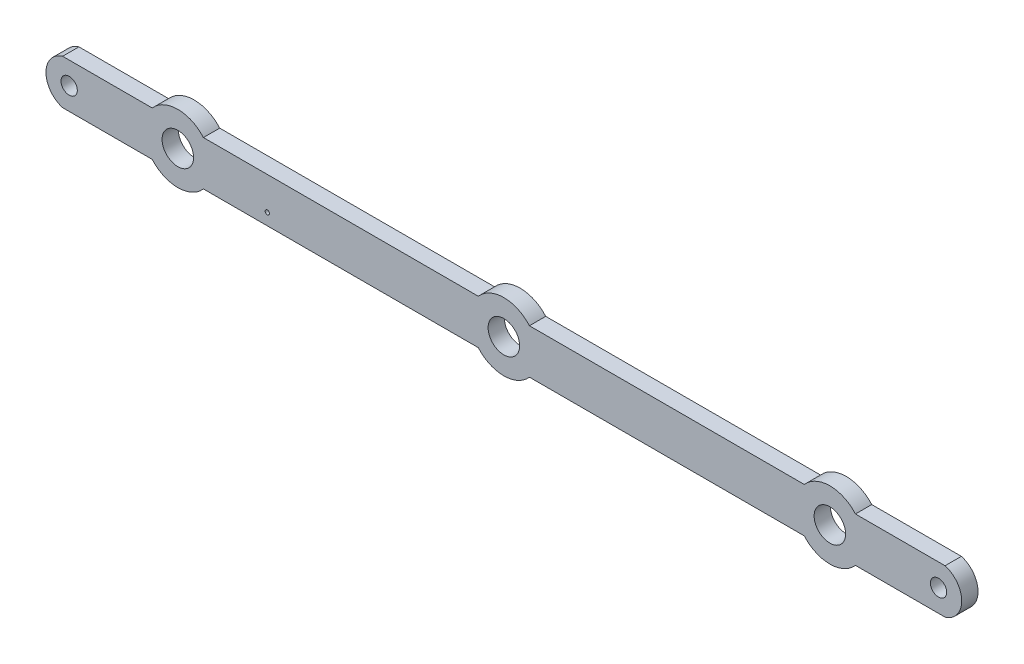
ISO-10303-21;
HEADER;
FILE_DESCRIPTION(('STEP AP214'),'2;1');
FILE_NAME('part.step','',(''),(''),'','','');
FILE_SCHEMA(('AUTOMOTIVE_DESIGN { 1 0 10303 214 1 1 1 1 }'));
ENDSEC;
DATA;
#1=APPLICATION_CONTEXT('core data for automotive mechanical design processes');
#2=APPLICATION_PROTOCOL_DEFINITION('international standard','automotive_design',2000,#1);
#3=PRODUCT_CONTEXT('',#1,'mechanical');
#4=PRODUCT('Part','Part','',(#3));
#5=PRODUCT_RELATED_PRODUCT_CATEGORY('part','',(#4));
#6=PRODUCT_DEFINITION_FORMATION('','',#4);
#7=PRODUCT_DEFINITION_CONTEXT('part definition',#1,'design');
#8=PRODUCT_DEFINITION('design','',#6,#7);
#9=PRODUCT_DEFINITION_SHAPE('','',#8);
#10=(LENGTH_UNIT() NAMED_UNIT(*) SI_UNIT(.MILLI.,.METRE.));
#11=(NAMED_UNIT(*) PLANE_ANGLE_UNIT() SI_UNIT($,.RADIAN.));
#12=(NAMED_UNIT(*) SI_UNIT($,.STERADIAN.) SOLID_ANGLE_UNIT());
#13=UNCERTAINTY_MEASURE_WITH_UNIT(LENGTH_MEASURE(1.E-05),#10,'distance_accuracy_value','');
#14=(GEOMETRIC_REPRESENTATION_CONTEXT(3) GLOBAL_UNCERTAINTY_ASSIGNED_CONTEXT((#13)) GLOBAL_UNIT_ASSIGNED_CONTEXT((#10,
#11,#12)) REPRESENTATION_CONTEXT('',''));
#15=CARTESIAN_POINT('',(0.,0.,0.));
#16=DIRECTION('',(0.,0.,1.));
#17=DIRECTION('',(1.,0.,0.));
#18=AXIS2_PLACEMENT_3D('',#15,#16,#17);
#19=CARTESIAN_POINT('',(-60.,0.,3.));
#20=DIRECTION('',(0.,0.,-1.));
#21=DIRECTION('',(-1.,0.,0.));
#22=AXIS2_PLACEMENT_3D('',#19,#20,#21);
#23=PLANE('',#22);
#24=CARTESIAN_POINT('',(-60.,0.,3.));
#25=DIRECTION('',(0.,0.,1.));
#26=DIRECTION('',(-1.,0.,0.));
#27=AXIS2_PLACEMENT_3D('',#24,#25,#26);
#28=CIRCLE('',#27,6.24);
#29=CARTESIAN_POINT('',(-55.2937429206202,4.09740702185994,3.));
#30=VERTEX_POINT('',#29);
#31=CARTESIAN_POINT('',(-64.7062570793798,4.09740702185994,3.));
#32=VERTEX_POINT('',#31);
#33=EDGE_CURVE('E217',#30,#32,#28,.T.);
#34=ORIENTED_EDGE('',*,*,#33,.T.);
#35=DIRECTION('',(-1.,0.,0.));
#36=VECTOR('',#35,1.);
#37=CARTESIAN_POINT('',(-81.2017302930412,4.09740702185994,3.));
#38=LINE('',#37,#36);
#39=CARTESIAN_POINT('',(-81.2017302930412,4.09740702185994,3.));
#40=VERTEX_POINT('',#39);
#41=EDGE_CURVE('E125',#32,#40,#38,.T.);
#42=ORIENTED_EDGE('',*,*,#41,.T.);
#43=CARTESIAN_POINT('',(-80.,0.,3.));
#44=DIRECTION('',(0.,0.,1.));
#45=DIRECTION('',(1.,0.,0.));
#46=AXIS2_PLACEMENT_3D('',#43,#44,#45);
#47=CIRCLE('',#46,4.27);
#48=CARTESIAN_POINT('',(-81.2017302930412,-4.09740702185994,3.));
#49=VERTEX_POINT('',#48);
#50=EDGE_CURVE('E256',#40,#49,#47,.T.);
#51=ORIENTED_EDGE('',*,*,#50,.T.);
#52=DIRECTION('',(1.,0.,0.));
#53=VECTOR('',#52,1.);
#54=CARTESIAN_POINT('',(-81.2017302930412,-4.09740702185994,3.));
#55=LINE('',#54,#53);
#56=CARTESIAN_POINT('',(-64.7062570793798,-4.09740702185994,3.));
#57=VERTEX_POINT('',#56);
#58=EDGE_CURVE('E275',#49,#57,#55,.T.);
#59=ORIENTED_EDGE('',*,*,#58,.T.);
#60=CARTESIAN_POINT('',(-60.,0.,3.));
#61=DIRECTION('',(0.,0.,1.));
#62=DIRECTION('',(1.,0.,0.));
#63=AXIS2_PLACEMENT_3D('',#60,#61,#62);
#64=CIRCLE('',#63,6.24);
#65=CARTESIAN_POINT('',(-55.2937429206202,-4.09740702185994,3.));
#66=VERTEX_POINT('',#65);
#67=EDGE_CURVE('E272',#57,#66,#64,.T.);
#68=ORIENTED_EDGE('',*,*,#67,.T.);
#69=DIRECTION('',(1.,0.,0.));
#70=VECTOR('',#69,1.);
#71=CARTESIAN_POINT('',(-55.2937429206202,-4.09740702185994,3.));
#72=LINE('',#71,#70);
#73=CARTESIAN_POINT('',(-4.70625707937984,-4.09740702185994,3.));
#74=VERTEX_POINT('',#73);
#75=EDGE_CURVE('E274',#66,#74,#72,.T.);
#76=ORIENTED_EDGE('',*,*,#75,.T.);
#77=CARTESIAN_POINT('',(0.,0.,3.));
#78=DIRECTION('',(0.,0.,1.));
#79=DIRECTION('',(1.,0.,0.));
#80=AXIS2_PLACEMENT_3D('',#77,#78,#79);
#81=CIRCLE('',#80,6.24);
#82=CARTESIAN_POINT('',(4.70625707937984,-4.09740702185994,3.));
#83=VERTEX_POINT('',#82);
#84=EDGE_CURVE('E277',#74,#83,#81,.T.);
#85=ORIENTED_EDGE('',*,*,#84,.T.);
#86=DIRECTION('',(1.,0.,0.));
#87=VECTOR('',#86,1.);
#88=CARTESIAN_POINT('',(4.70625707937984,-4.09740702185994,3.));
#89=LINE('',#88,#87);
#90=CARTESIAN_POINT('',(55.2937429206202,-4.09740702185994,3.));
#91=VERTEX_POINT('',#90);
#92=EDGE_CURVE('E283',#83,#91,#89,.T.);
#93=ORIENTED_EDGE('',*,*,#92,.T.);
#94=CARTESIAN_POINT('',(60.,0.,3.));
#95=DIRECTION('',(0.,0.,1.));
#96=DIRECTION('',(1.,0.,0.));
#97=AXIS2_PLACEMENT_3D('',#94,#95,#96);
#98=CIRCLE('',#97,6.24);
#99=CARTESIAN_POINT('',(64.7062570793798,-4.09740702185994,3.));
#100=VERTEX_POINT('',#99);
#101=EDGE_CURVE('E285',#91,#100,#98,.T.);
#102=ORIENTED_EDGE('',*,*,#101,.T.);
#103=DIRECTION('',(1.,0.,0.));
#104=VECTOR('',#103,1.);
#105=CARTESIAN_POINT('',(64.7062570793798,-4.09740702185994,3.));
#106=LINE('',#105,#104);
#107=CARTESIAN_POINT('',(81.2017302930412,-4.09740702185994,3.));
#108=VERTEX_POINT('',#107);
#109=EDGE_CURVE('E287',#100,#108,#106,.T.);
#110=ORIENTED_EDGE('',*,*,#109,.T.);
#111=CARTESIAN_POINT('',(80.,0.,3.));
#112=DIRECTION('',(0.,0.,1.));
#113=DIRECTION('',(-1.,0.,0.));
#114=AXIS2_PLACEMENT_3D('',#111,#112,#113);
#115=CIRCLE('',#114,4.27);
#116=CARTESIAN_POINT('',(81.2017302930412,4.09740702185994,3.));
#117=VERTEX_POINT('',#116);
#118=EDGE_CURVE('E289',#108,#117,#115,.T.);
#119=ORIENTED_EDGE('',*,*,#118,.T.);
#120=DIRECTION('',(-1.,0.,0.));
#121=VECTOR('',#120,1.);
#122=CARTESIAN_POINT('',(64.7062570793798,4.09740702185994,3.));
#123=LINE('',#122,#121);
#124=CARTESIAN_POINT('',(64.7062570793798,4.09740702185994,3.));
#125=VERTEX_POINT('',#124);
#126=EDGE_CURVE('E291',#117,#125,#123,.T.);
#127=ORIENTED_EDGE('',*,*,#126,.T.);
#128=CARTESIAN_POINT('',(60.,0.,3.));
#129=DIRECTION('',(0.,0.,1.));
#130=DIRECTION('',(1.,0.,0.));
#131=AXIS2_PLACEMENT_3D('',#128,#129,#130);
#132=CIRCLE('',#131,6.24);
#133=CARTESIAN_POINT('',(55.2937429206202,4.09740702185994,3.));
#134=VERTEX_POINT('',#133);
#135=EDGE_CURVE('E168',#125,#134,#132,.T.);
#136=ORIENTED_EDGE('',*,*,#135,.T.);
#137=DIRECTION('',(-1.,0.,0.));
#138=VECTOR('',#137,1.);
#139=CARTESIAN_POINT('',(4.70625707937984,4.09740702185994,3.));
#140=LINE('',#139,#138);
#141=CARTESIAN_POINT('',(4.70625707937984,4.09740702185994,3.));
#142=VERTEX_POINT('',#141);
#143=EDGE_CURVE('E162',#134,#142,#140,.T.);
#144=ORIENTED_EDGE('',*,*,#143,.T.);
#145=CARTESIAN_POINT('',(0.,0.,3.));
#146=DIRECTION('',(0.,0.,1.));
#147=DIRECTION('',(1.,0.,0.));
#148=AXIS2_PLACEMENT_3D('',#145,#146,#147);
#149=CIRCLE('',#148,6.24);
#150=CARTESIAN_POINT('',(-4.70625707937984,4.09740702185994,3.));
#151=VERTEX_POINT('',#150);
#152=EDGE_CURVE('E166',#142,#151,#149,.T.);
#153=ORIENTED_EDGE('',*,*,#152,.T.);
#154=DIRECTION('',(-1.,0.,0.));
#155=VECTOR('',#154,1.);
#156=CARTESIAN_POINT('',(-55.2937429206202,4.09740702185994,3.));
#157=LINE('',#156,#155);
#158=EDGE_CURVE('E58',#151,#30,#157,.T.);
#159=ORIENTED_EDGE('',*,*,#158,.T.);
#160=EDGE_LOOP('',(#34,#42,#51,#59,#68,#76,#85,#93,#102,#110,#119,#127,#136,#144,#153,#159));
#161=FACE_BOUND('',#160,.T.);
#162=CARTESIAN_POINT('',(-60.,0.,3.));
#163=DIRECTION('',(0.,0.,1.));
#164=DIRECTION('',(1.,0.,0.));
#165=AXIS2_PLACEMENT_3D('',#162,#163,#164);
#166=CIRCLE('',#165,2.9);
#167=CARTESIAN_POINT('',(-57.1,0.,3.));
#168=VERTEX_POINT('',#167);
#169=EDGE_CURVE('E190',#168,#168,#166,.T.);
#170=ORIENTED_EDGE('',*,*,#169,.F.);
#171=EDGE_LOOP('',(#170));
#172=FACE_BOUND('',#171,.T.);
#173=CARTESIAN_POINT('',(0.,0.,3.));
#174=DIRECTION('',(0.,0.,1.));
#175=DIRECTION('',(1.,0.,0.));
#176=AXIS2_PLACEMENT_3D('',#173,#174,#175);
#177=CIRCLE('',#176,2.9);
#178=CARTESIAN_POINT('',(2.9,0.,3.));
#179=VERTEX_POINT('',#178);
#180=EDGE_CURVE('E375',#179,#179,#177,.T.);
#181=ORIENTED_EDGE('',*,*,#180,.F.);
#182=EDGE_LOOP('',(#181));
#183=FACE_BOUND('',#182,.T.);
#184=CARTESIAN_POINT('',(60.,0.,3.));
#185=DIRECTION('',(0.,0.,1.));
#186=DIRECTION('',(1.,0.,0.));
#187=AXIS2_PLACEMENT_3D('',#184,#185,#186);
#188=CIRCLE('',#187,2.90000000000003);
#189=CARTESIAN_POINT('',(62.9,0.,3.));
#190=VERTEX_POINT('',#189);
#191=EDGE_CURVE('E369',#190,#190,#188,.T.);
#192=ORIENTED_EDGE('',*,*,#191,.F.);
#193=EDGE_LOOP('',(#192));
#194=FACE_BOUND('',#193,.T.);
#195=CARTESIAN_POINT('',(80.,0.,3.));
#196=DIRECTION('',(0.,0.,1.));
#197=DIRECTION('',(1.,0.,0.));
#198=AXIS2_PLACEMENT_3D('',#195,#196,#197);
#199=CIRCLE('',#198,1.5);
#200=CARTESIAN_POINT('',(81.5,0.,3.));
#201=VERTEX_POINT('',#200);
#202=EDGE_CURVE('E363',#201,#201,#199,.T.);
#203=ORIENTED_EDGE('',*,*,#202,.F.);
#204=EDGE_LOOP('',(#203));
#205=FACE_BOUND('',#204,.T.);
#206=CARTESIAN_POINT('',(-80.,0.,3.));
#207=DIRECTION('',(0.,0.,1.));
#208=DIRECTION('',(1.,0.,0.));
#209=AXIS2_PLACEMENT_3D('',#206,#207,#208);
#210=CIRCLE('',#209,1.5);
#211=CARTESIAN_POINT('',(-78.5,0.,3.));
#212=VERTEX_POINT('',#211);
#213=EDGE_CURVE('E357',#212,#212,#210,.T.);
#214=ORIENTED_EDGE('',*,*,#213,.F.);
#215=EDGE_LOOP('',(#214));
#216=FACE_BOUND('',#215,.T.);
#217=CARTESIAN_POINT('',(-43.533553557527,-1.94889321049629,3.));
#218=DIRECTION('',(0.,0.,1.));
#219=DIRECTION('',(1.,0.,0.));
#220=AXIS2_PLACEMENT_3D('',#217,#218,#219);
#221=CIRCLE('',#220,0.390297289311418);
#222=CARTESIAN_POINT('',(-43.1432562682156,-1.94889321049629,3.));
#223=VERTEX_POINT('',#222);
#224=EDGE_CURVE('E348',#223,#223,#221,.T.);
#225=ORIENTED_EDGE('',*,*,#224,.F.);
#226=EDGE_LOOP('',(#225));
#227=FACE_BOUND('',#226,.T.);
#228=ADVANCED_FACE('F41',(#161,#172,#183,#194,#205,#216,#227),#23,.F.);
#229=CARTESIAN_POINT('',(-60.,0.,0.));
#230=DIRECTION('',(0.,0.,-1.));
#231=DIRECTION('',(-1.,0.,0.));
#232=AXIS2_PLACEMENT_3D('',#229,#230,#231);
#233=PLANE('',#232);
#234=CARTESIAN_POINT('',(-80.,0.,0.));
#235=DIRECTION('',(0.,0.,1.));
#236=DIRECTION('',(1.,0.,0.));
#237=AXIS2_PLACEMENT_3D('',#234,#235,#236);
#238=CIRCLE('',#237,1.5);
#239=CARTESIAN_POINT('',(-78.5,0.,0.));
#240=VERTEX_POINT('',#239);
#241=EDGE_CURVE('E354',#240,#240,#238,.T.);
#242=ORIENTED_EDGE('',*,*,#241,.T.);
#243=EDGE_LOOP('',(#242));
#244=FACE_BOUND('',#243,.T.);
#245=CARTESIAN_POINT('',(60.,0.,0.));
#246=DIRECTION('',(0.,0.,1.));
#247=DIRECTION('',(1.,0.,0.));
#248=AXIS2_PLACEMENT_3D('',#245,#246,#247);
#249=CIRCLE('',#248,2.90000000000003);
#250=CARTESIAN_POINT('',(62.9,0.,0.));
#251=VERTEX_POINT('',#250);
#252=EDGE_CURVE('E366',#251,#251,#249,.T.);
#253=ORIENTED_EDGE('',*,*,#252,.T.);
#254=EDGE_LOOP('',(#253));
#255=FACE_BOUND('',#254,.T.);
#256=CARTESIAN_POINT('',(-60.,0.,0.));
#257=DIRECTION('',(0.,0.,1.));
#258=DIRECTION('',(1.,0.,0.));
#259=AXIS2_PLACEMENT_3D('',#256,#257,#258);
#260=CIRCLE('',#259,2.9);
#261=CARTESIAN_POINT('',(-57.1,0.,0.));
#262=VERTEX_POINT('',#261);
#263=EDGE_CURVE('E378',#262,#262,#260,.T.);
#264=ORIENTED_EDGE('',*,*,#263,.T.);
#265=EDGE_LOOP('',(#264));
#266=FACE_BOUND('',#265,.T.);
#267=CARTESIAN_POINT('',(-60.,0.,0.));
#268=DIRECTION('',(0.,0.,1.));
#269=DIRECTION('',(-1.,0.,0.));
#270=AXIS2_PLACEMENT_3D('',#267,#268,#269);
#271=CIRCLE('',#270,6.24);
#272=CARTESIAN_POINT('',(-55.2937429206202,4.09740702185994,0.));
#273=VERTEX_POINT('',#272);
#274=CARTESIAN_POINT('',(-64.7062570793798,4.09740702185994,0.));
#275=VERTEX_POINT('',#274);
#276=EDGE_CURVE('E186',#273,#275,#271,.T.);
#277=ORIENTED_EDGE('',*,*,#276,.F.);
#278=DIRECTION('',(-1.,0.,0.));
#279=VECTOR('',#278,1.);
#280=CARTESIAN_POINT('',(-55.2937429206202,4.09740702185994,0.));
#281=LINE('',#280,#279);
#282=CARTESIAN_POINT('',(-4.70625707937984,4.09740702185994,0.));
#283=VERTEX_POINT('',#282);
#284=EDGE_CURVE('E117',#283,#273,#281,.T.);
#285=ORIENTED_EDGE('',*,*,#284,.F.);
#286=CARTESIAN_POINT('',(0.,0.,0.));
#287=DIRECTION('',(0.,0.,1.));
#288=DIRECTION('',(1.,0.,0.));
#289=AXIS2_PLACEMENT_3D('',#286,#287,#288);
#290=CIRCLE('',#289,6.24);
#291=CARTESIAN_POINT('',(4.70625707937984,4.09740702185994,0.));
#292=VERTEX_POINT('',#291);
#293=EDGE_CURVE('E111',#292,#283,#290,.T.);
#294=ORIENTED_EDGE('',*,*,#293,.F.);
#295=DIRECTION('',(-1.,0.,0.));
#296=VECTOR('',#295,1.);
#297=CARTESIAN_POINT('',(4.70625707937984,4.09740702185994,0.));
#298=LINE('',#297,#296);
#299=CARTESIAN_POINT('',(55.2937429206202,4.09740702185994,0.));
#300=VERTEX_POINT('',#299);
#301=EDGE_CURVE('E176',#300,#292,#298,.T.);
#302=ORIENTED_EDGE('',*,*,#301,.F.);
#303=CARTESIAN_POINT('',(60.,0.,0.));
#304=DIRECTION('',(0.,0.,1.));
#305=DIRECTION('',(1.,0.,0.));
#306=AXIS2_PLACEMENT_3D('',#303,#304,#305);
#307=CIRCLE('',#306,6.24);
#308=CARTESIAN_POINT('',(64.7062570793798,4.09740702185994,0.));
#309=VERTEX_POINT('',#308);
#310=EDGE_CURVE('E212',#309,#300,#307,.T.);
#311=ORIENTED_EDGE('',*,*,#310,.F.);
#312=DIRECTION('',(-1.,0.,0.));
#313=VECTOR('',#312,1.);
#314=CARTESIAN_POINT('',(64.7062570793798,4.09740702185994,0.));
#315=LINE('',#314,#313);
#316=CARTESIAN_POINT('',(81.2017302930412,4.09740702185994,0.));
#317=VERTEX_POINT('',#316);
#318=EDGE_CURVE('E210',#317,#309,#315,.T.);
#319=ORIENTED_EDGE('',*,*,#318,.F.);
#320=CARTESIAN_POINT('',(80.,0.,0.));
#321=DIRECTION('',(0.,0.,1.));
#322=DIRECTION('',(-1.,0.,0.));
#323=AXIS2_PLACEMENT_3D('',#320,#321,#322);
#324=CIRCLE('',#323,4.27);
#325=CARTESIAN_POINT('',(81.2017302930412,-4.09740702185994,0.));
#326=VERTEX_POINT('',#325);
#327=EDGE_CURVE('E208',#326,#317,#324,.T.);
#328=ORIENTED_EDGE('',*,*,#327,.F.);
#329=DIRECTION('',(1.,0.,0.));
#330=VECTOR('',#329,1.);
#331=CARTESIAN_POINT('',(64.7062570793798,-4.09740702185994,0.));
#332=LINE('',#331,#330);
#333=CARTESIAN_POINT('',(64.7062570793798,-4.09740702185994,0.));
#334=VERTEX_POINT('',#333);
#335=EDGE_CURVE('E206',#334,#326,#332,.T.);
#336=ORIENTED_EDGE('',*,*,#335,.F.);
#337=CARTESIAN_POINT('',(60.,0.,0.));
#338=DIRECTION('',(0.,0.,1.));
#339=DIRECTION('',(1.,0.,0.));
#340=AXIS2_PLACEMENT_3D('',#337,#338,#339);
#341=CIRCLE('',#340,6.24);
#342=CARTESIAN_POINT('',(55.2937429206202,-4.09740702185994,0.));
#343=VERTEX_POINT('',#342);
#344=EDGE_CURVE('E204',#343,#334,#341,.T.);
#345=ORIENTED_EDGE('',*,*,#344,.F.);
#346=DIRECTION('',(1.,0.,0.));
#347=VECTOR('',#346,1.);
#348=CARTESIAN_POINT('',(4.70625707937984,-4.09740702185994,0.));
#349=LINE('',#348,#347);
#350=CARTESIAN_POINT('',(4.70625707937984,-4.09740702185994,0.));
#351=VERTEX_POINT('',#350);
#352=EDGE_CURVE('E202',#351,#343,#349,.T.);
#353=ORIENTED_EDGE('',*,*,#352,.F.);
#354=CARTESIAN_POINT('',(0.,0.,0.));
#355=DIRECTION('',(0.,0.,1.));
#356=DIRECTION('',(1.,0.,0.));
#357=AXIS2_PLACEMENT_3D('',#354,#355,#356);
#358=CIRCLE('',#357,6.24);
#359=CARTESIAN_POINT('',(-4.70625707937984,-4.09740702185994,0.));
#360=VERTEX_POINT('',#359);
#361=EDGE_CURVE('E200',#360,#351,#358,.T.);
#362=ORIENTED_EDGE('',*,*,#361,.F.);
#363=DIRECTION('',(1.,0.,0.));
#364=VECTOR('',#363,1.);
#365=CARTESIAN_POINT('',(-55.2937429206202,-4.09740702185994,0.));
#366=LINE('',#365,#364);
#367=CARTESIAN_POINT('',(-55.2937429206202,-4.09740702185994,0.));
#368=VERTEX_POINT('',#367);
#369=EDGE_CURVE('E198',#368,#360,#366,.T.);
#370=ORIENTED_EDGE('',*,*,#369,.F.);
#371=CARTESIAN_POINT('',(-60.,0.,0.));
#372=DIRECTION('',(0.,0.,1.));
#373=DIRECTION('',(1.,0.,0.));
#374=AXIS2_PLACEMENT_3D('',#371,#372,#373);
#375=CIRCLE('',#374,6.24);
#376=CARTESIAN_POINT('',(-64.7062570793798,-4.09740702185994,0.));
#377=VERTEX_POINT('',#376);
#378=EDGE_CURVE('E196',#377,#368,#375,.T.);
#379=ORIENTED_EDGE('',*,*,#378,.F.);
#380=DIRECTION('',(1.,0.,0.));
#381=VECTOR('',#380,1.);
#382=CARTESIAN_POINT('',(-81.2017302930412,-4.09740702185994,0.));
#383=LINE('',#382,#381);
#384=CARTESIAN_POINT('',(-81.2017302930412,-4.09740702185994,0.));
#385=VERTEX_POINT('',#384);
#386=EDGE_CURVE('E194',#385,#377,#383,.T.);
#387=ORIENTED_EDGE('',*,*,#386,.F.);
#388=CARTESIAN_POINT('',(-80.,0.,0.));
#389=DIRECTION('',(0.,0.,1.));
#390=DIRECTION('',(1.,0.,0.));
#391=AXIS2_PLACEMENT_3D('',#388,#389,#390);
#392=CIRCLE('',#391,4.27);
#393=CARTESIAN_POINT('',(-81.2017302930412,4.09740702185994,0.));
#394=VERTEX_POINT('',#393);
#395=EDGE_CURVE('E192',#394,#385,#392,.T.);
#396=ORIENTED_EDGE('',*,*,#395,.F.);
#397=DIRECTION('',(-1.,0.,0.));
#398=VECTOR('',#397,1.);
#399=CARTESIAN_POINT('',(-81.2017302930412,4.09740702185994,0.));
#400=LINE('',#399,#398);
#401=EDGE_CURVE('E189',#275,#394,#400,.T.);
#402=ORIENTED_EDGE('',*,*,#401,.F.);
#403=EDGE_LOOP('',(#277,#285,#294,#302,#311,#319,#328,#336,#345,#353,#362,#370,#379,#387,#396,#402));
#404=FACE_BOUND('',#403,.T.);
#405=CARTESIAN_POINT('',(0.,0.,0.));
#406=DIRECTION('',(0.,0.,1.));
#407=DIRECTION('',(1.,0.,0.));
#408=AXIS2_PLACEMENT_3D('',#405,#406,#407);
#409=CIRCLE('',#408,2.9);
#410=CARTESIAN_POINT('',(2.9,0.,0.));
#411=VERTEX_POINT('',#410);
#412=EDGE_CURVE('E372',#411,#411,#409,.T.);
#413=ORIENTED_EDGE('',*,*,#412,.T.);
#414=EDGE_LOOP('',(#413));
#415=FACE_BOUND('',#414,.T.);
#416=CARTESIAN_POINT('',(80.,0.,0.));
#417=DIRECTION('',(0.,0.,1.));
#418=DIRECTION('',(1.,0.,0.));
#419=AXIS2_PLACEMENT_3D('',#416,#417,#418);
#420=CIRCLE('',#419,1.5);
#421=CARTESIAN_POINT('',(81.5,0.,0.));
#422=VERTEX_POINT('',#421);
#423=EDGE_CURVE('E360',#422,#422,#420,.T.);
#424=ORIENTED_EDGE('',*,*,#423,.T.);
#425=EDGE_LOOP('',(#424));
#426=FACE_BOUND('',#425,.T.);
#427=CARTESIAN_POINT('',(-43.533553557527,-1.94889321049629,0.));
#428=DIRECTION('',(0.,0.,1.));
#429=DIRECTION('',(1.,0.,0.));
#430=AXIS2_PLACEMENT_3D('',#427,#428,#429);
#431=CIRCLE('',#430,0.390297289311418);
#432=CARTESIAN_POINT('',(-43.1432562682156,-1.94889321049629,0.));
#433=VERTEX_POINT('',#432);
#434=EDGE_CURVE('E351',#433,#433,#431,.T.);
#435=ORIENTED_EDGE('',*,*,#434,.T.);
#436=EDGE_LOOP('',(#435));
#437=FACE_BOUND('',#436,.T.);
#438=ADVANCED_FACE('F260',(#244,#255,#266,#404,#415,#426,#437),#233,.T.);
#439=CARTESIAN_POINT('',(-60.,0.,3.));
#440=DIRECTION('',(0.,0.,-1.));
#441=DIRECTION('',(-1.,0.,0.));
#442=AXIS2_PLACEMENT_3D('',#439,#440,#441);
#443=CYLINDRICAL_SURFACE('',#442,6.24);
#444=ORIENTED_EDGE('',*,*,#276,.T.);
#445=DIRECTION('',(0.,0.,-1.));
#446=VECTOR('',#445,1.);
#447=CARTESIAN_POINT('',(-64.7062570793798,4.09740702185994,3.));
#448=LINE('',#447,#446);
#449=EDGE_CURVE('E11',#32,#275,#448,.T.);
#450=ORIENTED_EDGE('',*,*,#449,.F.);
#451=ORIENTED_EDGE('',*,*,#33,.F.);
#452=DIRECTION('',(0.,0.,-1.));
#453=VECTOR('',#452,1.);
#454=CARTESIAN_POINT('',(-55.2937429206202,4.09740702185994,3.));
#455=LINE('',#454,#453);
#456=EDGE_CURVE('E182',#30,#273,#455,.T.);
#457=ORIENTED_EDGE('',*,*,#456,.T.);
#458=EDGE_LOOP('',(#444,#450,#451,#457));
#459=FACE_BOUND('',#458,.T.);
#460=ADVANCED_FACE('F43',(#459),#443,.T.);
#461=CARTESIAN_POINT('',(-81.2017302930412,4.09740702185994,3.));
#462=DIRECTION('',(0.,-1.,0.));
#463=DIRECTION('',(0.,0.,-1.));
#464=AXIS2_PLACEMENT_3D('',#461,#462,#463);
#465=PLANE('',#464);
#466=ORIENTED_EDGE('',*,*,#401,.T.);
#467=DIRECTION('',(0.,0.,-1.));
#468=VECTOR('',#467,1.);
#469=CARTESIAN_POINT('',(-81.2017302930412,4.09740702185994,3.));
#470=LINE('',#469,#468);
#471=EDGE_CURVE('E50',#40,#394,#470,.T.);
#472=ORIENTED_EDGE('',*,*,#471,.F.);
#473=ORIENTED_EDGE('',*,*,#41,.F.);
#474=ORIENTED_EDGE('',*,*,#449,.T.);
#475=EDGE_LOOP('',(#466,#472,#473,#474));
#476=FACE_BOUND('',#475,.T.);
#477=ADVANCED_FACE('F562',(#476),#465,.F.);
#478=CARTESIAN_POINT('',(-80.,0.,3.));
#479=DIRECTION('',(0.,0.,-1.));
#480=DIRECTION('',(-1.,0.,0.));
#481=AXIS2_PLACEMENT_3D('',#478,#479,#480);
#482=CYLINDRICAL_SURFACE('',#481,4.27);
#483=ORIENTED_EDGE('',*,*,#395,.T.);
#484=DIRECTION('',(0.,0.,-1.));
#485=VECTOR('',#484,1.);
#486=CARTESIAN_POINT('',(-81.2017302930412,-4.09740702185994,3.));
#487=LINE('',#486,#485);
#488=EDGE_CURVE('E248',#49,#385,#487,.T.);
#489=ORIENTED_EDGE('',*,*,#488,.F.);
#490=ORIENTED_EDGE('',*,*,#50,.F.);
#491=ORIENTED_EDGE('',*,*,#471,.T.);
#492=EDGE_LOOP('',(#483,#489,#490,#491));
#493=FACE_BOUND('',#492,.T.);
#494=ADVANCED_FACE('F254',(#493),#482,.T.);
#495=CARTESIAN_POINT('',(-81.2017302930412,-4.09740702185994,3.));
#496=DIRECTION('',(0.,1.,0.));
#497=DIRECTION('',(0.,0.,1.));
#498=AXIS2_PLACEMENT_3D('',#495,#496,#497);
#499=PLANE('',#498);
#500=ORIENTED_EDGE('',*,*,#386,.T.);
#501=DIRECTION('',(0.,0.,-1.));
#502=VECTOR('',#501,1.);
#503=CARTESIAN_POINT('',(-64.7062570793798,-4.09740702185994,3.));
#504=LINE('',#503,#502);
#505=EDGE_CURVE('E245',#57,#377,#504,.T.);
#506=ORIENTED_EDGE('',*,*,#505,.F.);
#507=ORIENTED_EDGE('',*,*,#58,.F.);
#508=ORIENTED_EDGE('',*,*,#488,.T.);
#509=EDGE_LOOP('',(#500,#506,#507,#508));
#510=FACE_BOUND('',#509,.T.);
#511=ADVANCED_FACE('F266',(#510),#499,.F.);
#512=CARTESIAN_POINT('',(-60.,0.,3.));
#513=DIRECTION('',(0.,0.,-1.));
#514=DIRECTION('',(-1.,0.,0.));
#515=AXIS2_PLACEMENT_3D('',#512,#513,#514);
#516=CYLINDRICAL_SURFACE('',#515,6.24);
#517=ORIENTED_EDGE('',*,*,#378,.T.);
#518=DIRECTION('',(0.,0.,-1.));
#519=VECTOR('',#518,1.);
#520=CARTESIAN_POINT('',(-55.2937429206202,-4.09740702185994,3.));
#521=LINE('',#520,#519);
#522=EDGE_CURVE('E242',#66,#368,#521,.T.);
#523=ORIENTED_EDGE('',*,*,#522,.F.);
#524=ORIENTED_EDGE('',*,*,#67,.F.);
#525=ORIENTED_EDGE('',*,*,#505,.T.);
#526=EDGE_LOOP('',(#517,#523,#524,#525));
#527=FACE_BOUND('',#526,.T.);
#528=ADVANCED_FACE('F270',(#527),#516,.T.);
#529=CARTESIAN_POINT('',(-55.2937429206202,-4.09740702185994,3.));
#530=DIRECTION('',(0.,1.,0.));
#531=DIRECTION('',(-1.,0.,0.));
#532=AXIS2_PLACEMENT_3D('',#529,#530,#531);
#533=PLANE('',#532);
#534=ORIENTED_EDGE('',*,*,#369,.T.);
#535=DIRECTION('',(0.,0.,-1.));
#536=VECTOR('',#535,1.);
#537=CARTESIAN_POINT('',(-4.70625707937984,-4.09740702185994,3.));
#538=LINE('',#537,#536);
#539=EDGE_CURVE('E239',#74,#360,#538,.T.);
#540=ORIENTED_EDGE('',*,*,#539,.F.);
#541=ORIENTED_EDGE('',*,*,#75,.F.);
#542=ORIENTED_EDGE('',*,*,#522,.T.);
#543=EDGE_LOOP('',(#534,#540,#541,#542));
#544=FACE_BOUND('',#543,.T.);
#545=ADVANCED_FACE('F523',(#544),#533,.F.);
#546=CARTESIAN_POINT('',(0.,0.,3.));
#547=DIRECTION('',(0.,0.,-1.));
#548=DIRECTION('',(-1.,0.,0.));
#549=AXIS2_PLACEMENT_3D('',#546,#547,#548);
#550=CYLINDRICAL_SURFACE('',#549,6.24);
#551=ORIENTED_EDGE('',*,*,#361,.T.);
#552=DIRECTION('',(0.,0.,-1.));
#553=VECTOR('',#552,1.);
#554=CARTESIAN_POINT('',(4.70625707937984,-4.09740702185994,3.));
#555=LINE('',#554,#553);
#556=EDGE_CURVE('E236',#83,#351,#555,.T.);
#557=ORIENTED_EDGE('',*,*,#556,.F.);
#558=ORIENTED_EDGE('',*,*,#84,.F.);
#559=ORIENTED_EDGE('',*,*,#539,.T.);
#560=EDGE_LOOP('',(#551,#557,#558,#559));
#561=FACE_BOUND('',#560,.T.);
#562=ADVANCED_FACE('F512',(#561),#550,.T.);
#563=CARTESIAN_POINT('',(4.70625707937984,-4.09740702185994,3.));
#564=DIRECTION('',(0.,1.,0.));
#565=DIRECTION('',(-1.,0.,0.));
#566=AXIS2_PLACEMENT_3D('',#563,#564,#565);
#567=PLANE('',#566);
#568=ORIENTED_EDGE('',*,*,#352,.T.);
#569=DIRECTION('',(0.,0.,-1.));
#570=VECTOR('',#569,1.);
#571=CARTESIAN_POINT('',(55.2937429206202,-4.09740702185994,3.));
#572=LINE('',#571,#570);
#573=EDGE_CURVE('E233',#91,#343,#572,.T.);
#574=ORIENTED_EDGE('',*,*,#573,.F.);
#575=ORIENTED_EDGE('',*,*,#92,.F.);
#576=ORIENTED_EDGE('',*,*,#556,.T.);
#577=EDGE_LOOP('',(#568,#574,#575,#576));
#578=FACE_BOUND('',#577,.T.);
#579=ADVANCED_FACE('F501',(#578),#567,.F.);
#580=CARTESIAN_POINT('',(60.,0.,3.));
#581=DIRECTION('',(0.,0.,-1.));
#582=DIRECTION('',(-1.,0.,0.));
#583=AXIS2_PLACEMENT_3D('',#580,#581,#582);
#584=CYLINDRICAL_SURFACE('',#583,6.24);
#585=ORIENTED_EDGE('',*,*,#344,.T.);
#586=DIRECTION('',(0.,0.,-1.));
#587=VECTOR('',#586,1.);
#588=CARTESIAN_POINT('',(64.7062570793798,-4.09740702185994,3.));
#589=LINE('',#588,#587);
#590=EDGE_CURVE('E230',#100,#334,#589,.T.);
#591=ORIENTED_EDGE('',*,*,#590,.F.);
#592=ORIENTED_EDGE('',*,*,#101,.F.);
#593=ORIENTED_EDGE('',*,*,#573,.T.);
#594=EDGE_LOOP('',(#585,#591,#592,#593));
#595=FACE_BOUND('',#594,.T.);
#596=ADVANCED_FACE('F490',(#595),#584,.T.);
#597=CARTESIAN_POINT('',(64.7062570793798,-4.09740702185994,3.));
#598=DIRECTION('',(0.,1.,0.));
#599=DIRECTION('',(-1.,0.,0.));
#600=AXIS2_PLACEMENT_3D('',#597,#598,#599);
#601=PLANE('',#600);
#602=ORIENTED_EDGE('',*,*,#335,.T.);
#603=DIRECTION('',(0.,0.,-1.));
#604=VECTOR('',#603,1.);
#605=CARTESIAN_POINT('',(81.2017302930412,-4.09740702185994,3.));
#606=LINE('',#605,#604);
#607=EDGE_CURVE('E227',#108,#326,#606,.T.);
#608=ORIENTED_EDGE('',*,*,#607,.F.);
#609=ORIENTED_EDGE('',*,*,#109,.F.);
#610=ORIENTED_EDGE('',*,*,#590,.T.);
#611=EDGE_LOOP('',(#602,#608,#609,#610));
#612=FACE_BOUND('',#611,.T.);
#613=ADVANCED_FACE('F479',(#612),#601,.F.);
#614=CARTESIAN_POINT('',(80.,0.,3.));
#615=DIRECTION('',(0.,0.,-1.));
#616=DIRECTION('',(-1.,0.,0.));
#617=AXIS2_PLACEMENT_3D('',#614,#615,#616);
#618=CYLINDRICAL_SURFACE('',#617,4.27);
#619=ORIENTED_EDGE('',*,*,#327,.T.);
#620=DIRECTION('',(0.,0.,-1.));
#621=VECTOR('',#620,1.);
#622=CARTESIAN_POINT('',(81.2017302930412,4.09740702185994,3.));
#623=LINE('',#622,#621);
#624=EDGE_CURVE('E224',#117,#317,#623,.T.);
#625=ORIENTED_EDGE('',*,*,#624,.F.);
#626=ORIENTED_EDGE('',*,*,#118,.F.);
#627=ORIENTED_EDGE('',*,*,#607,.T.);
#628=EDGE_LOOP('',(#619,#625,#626,#627));
#629=FACE_BOUND('',#628,.T.);
#630=ADVANCED_FACE('F469',(#629),#618,.T.);
#631=CARTESIAN_POINT('',(64.7062570793798,4.09740702185994,3.));
#632=DIRECTION('',(0.,-1.,0.));
#633=DIRECTION('',(1.,0.,0.));
#634=AXIS2_PLACEMENT_3D('',#631,#632,#633);
#635=PLANE('',#634);
#636=ORIENTED_EDGE('',*,*,#318,.T.);
#637=DIRECTION('',(0.,0.,-1.));
#638=VECTOR('',#637,1.);
#639=CARTESIAN_POINT('',(64.7062570793798,4.09740702185994,3.));
#640=LINE('',#639,#638);
#641=EDGE_CURVE('E221',#125,#309,#640,.T.);
#642=ORIENTED_EDGE('',*,*,#641,.F.);
#643=ORIENTED_EDGE('',*,*,#126,.F.);
#644=ORIENTED_EDGE('',*,*,#624,.T.);
#645=EDGE_LOOP('',(#636,#642,#643,#644));
#646=FACE_BOUND('',#645,.T.);
#647=ADVANCED_FACE('F297',(#646),#635,.F.);
#648=CARTESIAN_POINT('',(60.,0.,3.));
#649=DIRECTION('',(0.,0.,-1.));
#650=DIRECTION('',(-1.,0.,0.));
#651=AXIS2_PLACEMENT_3D('',#648,#649,#650);
#652=CYLINDRICAL_SURFACE('',#651,6.24);
#653=ORIENTED_EDGE('',*,*,#310,.T.);
#654=DIRECTION('',(0.,0.,-1.));
#655=VECTOR('',#654,1.);
#656=CARTESIAN_POINT('',(55.2937429206202,4.09740702185994,3.));
#657=LINE('',#656,#655);
#658=EDGE_CURVE('E177',#134,#300,#657,.T.);
#659=ORIENTED_EDGE('',*,*,#658,.F.);
#660=ORIENTED_EDGE('',*,*,#135,.F.);
#661=ORIENTED_EDGE('',*,*,#641,.T.);
#662=EDGE_LOOP('',(#653,#659,#660,#661));
#663=FACE_BOUND('',#662,.T.);
#664=ADVANCED_FACE('F301',(#663),#652,.T.);
#665=CARTESIAN_POINT('',(4.70625707937984,4.09740702185994,3.));
#666=DIRECTION('',(0.,-1.,0.));
#667=DIRECTION('',(1.,0.,0.));
#668=AXIS2_PLACEMENT_3D('',#665,#666,#667);
#669=PLANE('',#668);
#670=ORIENTED_EDGE('',*,*,#301,.T.);
#671=DIRECTION('',(0.,0.,-1.));
#672=VECTOR('',#671,1.);
#673=CARTESIAN_POINT('',(4.70625707937984,4.09740702185994,3.));
#674=LINE('',#673,#672);
#675=EDGE_CURVE('E173',#142,#292,#674,.T.);
#676=ORIENTED_EDGE('',*,*,#675,.F.);
#677=ORIENTED_EDGE('',*,*,#143,.F.);
#678=ORIENTED_EDGE('',*,*,#658,.T.);
#679=EDGE_LOOP('',(#670,#676,#677,#678));
#680=FACE_BOUND('',#679,.T.);
#681=ADVANCED_FACE('F174',(#680),#669,.F.);
#682=CARTESIAN_POINT('',(0.,0.,3.));
#683=DIRECTION('',(0.,0.,-1.));
#684=DIRECTION('',(-1.,0.,0.));
#685=AXIS2_PLACEMENT_3D('',#682,#683,#684);
#686=CYLINDRICAL_SURFACE('',#685,6.24);
#687=ORIENTED_EDGE('',*,*,#293,.T.);
#688=DIRECTION('',(0.,0.,-1.));
#689=VECTOR('',#688,1.);
#690=CARTESIAN_POINT('',(-4.70625707937984,4.09740702185994,3.));
#691=LINE('',#690,#689);
#692=EDGE_CURVE('E178',#151,#283,#691,.T.);
#693=ORIENTED_EDGE('',*,*,#692,.F.);
#694=ORIENTED_EDGE('',*,*,#152,.F.);
#695=ORIENTED_EDGE('',*,*,#675,.T.);
#696=EDGE_LOOP('',(#687,#693,#694,#695));
#697=FACE_BOUND('',#696,.T.);
#698=ADVANCED_FACE('F180',(#697),#686,.T.);
#699=CARTESIAN_POINT('',(-55.2937429206202,4.09740702185994,3.));
#700=DIRECTION('',(0.,-1.,0.));
#701=DIRECTION('',(1.,0.,0.));
#702=AXIS2_PLACEMENT_3D('',#699,#700,#701);
#703=PLANE('',#702);
#704=ORIENTED_EDGE('',*,*,#284,.T.);
#705=ORIENTED_EDGE('',*,*,#456,.F.);
#706=ORIENTED_EDGE('',*,*,#158,.F.);
#707=ORIENTED_EDGE('',*,*,#692,.T.);
#708=EDGE_LOOP('',(#704,#705,#706,#707));
#709=FACE_BOUND('',#708,.T.);
#710=ADVANCED_FACE('F305',(#709),#703,.F.);
#711=CARTESIAN_POINT('',(-60.,0.,3.));
#712=DIRECTION('',(0.,0.,-1.));
#713=DIRECTION('',(-1.,0.,0.));
#714=AXIS2_PLACEMENT_3D('',#711,#712,#713);
#715=CYLINDRICAL_SURFACE('',#714,2.9);
#716=ORIENTED_EDGE('',*,*,#169,.T.);
#717=EDGE_LOOP('',(#716));
#718=FACE_BOUND('',#717,.T.);
#719=ORIENTED_EDGE('',*,*,#263,.F.);
#720=EDGE_LOOP('',(#719));
#721=FACE_BOUND('',#720,.T.);
#722=ADVANCED_FACE('F307',(#718,#721),#715,.F.);
#723=CARTESIAN_POINT('',(0.,0.,3.));
#724=DIRECTION('',(0.,0.,-1.));
#725=DIRECTION('',(-1.,0.,0.));
#726=AXIS2_PLACEMENT_3D('',#723,#724,#725);
#727=CYLINDRICAL_SURFACE('',#726,2.9);
#728=ORIENTED_EDGE('',*,*,#180,.T.);
#729=EDGE_LOOP('',(#728));
#730=FACE_BOUND('',#729,.T.);
#731=ORIENTED_EDGE('',*,*,#412,.F.);
#732=EDGE_LOOP('',(#731));
#733=FACE_BOUND('',#732,.T.);
#734=ADVANCED_FACE('F313',(#730,#733),#727,.F.);
#735=CARTESIAN_POINT('',(60.,0.,3.));
#736=DIRECTION('',(0.,0.,-1.));
#737=DIRECTION('',(-1.,0.,0.));
#738=AXIS2_PLACEMENT_3D('',#735,#736,#737);
#739=CYLINDRICAL_SURFACE('',#738,2.90000000000003);
#740=ORIENTED_EDGE('',*,*,#191,.T.);
#741=EDGE_LOOP('',(#740));
#742=FACE_BOUND('',#741,.T.);
#743=ORIENTED_EDGE('',*,*,#252,.F.);
#744=EDGE_LOOP('',(#743));
#745=FACE_BOUND('',#744,.T.);
#746=ADVANCED_FACE('F327',(#742,#745),#739,.F.);
#747=CARTESIAN_POINT('',(80.,0.,3.));
#748=DIRECTION('',(0.,0.,-1.));
#749=DIRECTION('',(-1.,0.,0.));
#750=AXIS2_PLACEMENT_3D('',#747,#748,#749);
#751=CYLINDRICAL_SURFACE('',#750,1.5);
#752=ORIENTED_EDGE('',*,*,#202,.T.);
#753=EDGE_LOOP('',(#752));
#754=FACE_BOUND('',#753,.T.);
#755=ORIENTED_EDGE('',*,*,#423,.F.);
#756=EDGE_LOOP('',(#755));
#757=FACE_BOUND('',#756,.T.);
#758=ADVANCED_FACE('F331',(#754,#757),#751,.F.);
#759=CARTESIAN_POINT('',(-80.,0.,3.));
#760=DIRECTION('',(0.,0.,-1.));
#761=DIRECTION('',(-1.,0.,0.));
#762=AXIS2_PLACEMENT_3D('',#759,#760,#761);
#763=CYLINDRICAL_SURFACE('',#762,1.5);
#764=ORIENTED_EDGE('',*,*,#213,.T.);
#765=EDGE_LOOP('',(#764));
#766=FACE_BOUND('',#765,.T.);
#767=ORIENTED_EDGE('',*,*,#241,.F.);
#768=EDGE_LOOP('',(#767));
#769=FACE_BOUND('',#768,.T.);
#770=ADVANCED_FACE('F335',(#766,#769),#763,.F.);
#771=CARTESIAN_POINT('',(-43.533553557527,-1.94889321049629,3.));
#772=DIRECTION('',(0.,0.,-1.));
#773=DIRECTION('',(-1.,0.,0.));
#774=AXIS2_PLACEMENT_3D('',#771,#772,#773);
#775=CYLINDRICAL_SURFACE('',#774,0.390297289311418);
#776=ORIENTED_EDGE('',*,*,#224,.T.);
#777=EDGE_LOOP('',(#776));
#778=FACE_BOUND('',#777,.T.);
#779=ORIENTED_EDGE('',*,*,#434,.F.);
#780=EDGE_LOOP('',(#779));
#781=FACE_BOUND('',#780,.T.);
#782=ADVANCED_FACE('F339',(#778,#781),#775,.F.);
#783=CLOSED_SHELL('',(#228,#438,#460,#477,#494,#511,#528,#545,#562,#579,#596,#613,#630,#647,
#664,#681,#698,#710,#722,#734,#746,#758,#770,#782));
#784=MANIFOLD_SOLID_BREP('B2',#783);
#785=ADVANCED_BREP_SHAPE_REPRESENTATION('',(#18,#784),#14);
#786=SHAPE_DEFINITION_REPRESENTATION(#9,#785);
ENDSEC;
END-ISO-10303-21;
